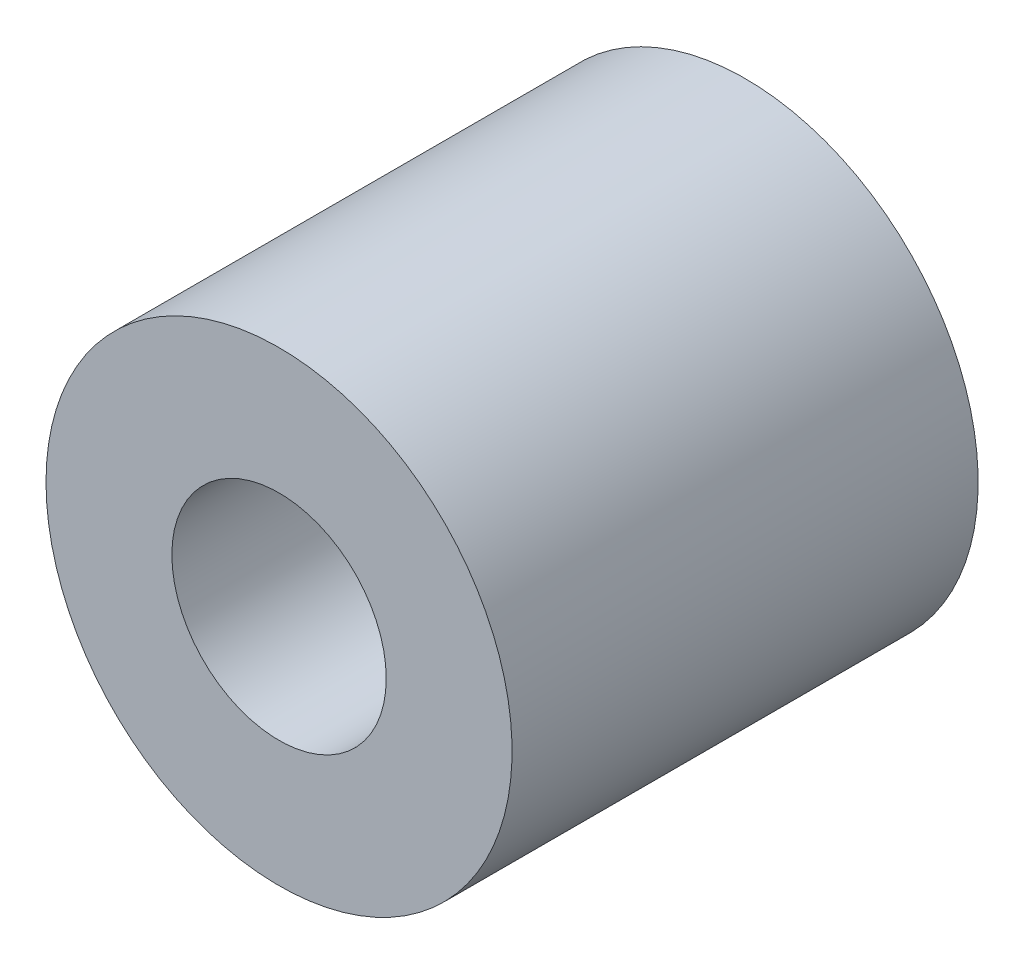
ISO-10303-21;
HEADER;
FILE_DESCRIPTION(('STEP AP214'),'2;1');
FILE_NAME('part.step','',(''),(''),'','','');
FILE_SCHEMA(('AUTOMOTIVE_DESIGN { 1 0 10303 214 1 1 1 1 }'));
ENDSEC;
DATA;
#1=APPLICATION_CONTEXT('core data for automotive mechanical design processes');
#2=APPLICATION_PROTOCOL_DEFINITION('international standard','automotive_design',2000,#1);
#3=PRODUCT_CONTEXT('',#1,'mechanical');
#4=PRODUCT('Part','Part','',(#3));
#5=PRODUCT_RELATED_PRODUCT_CATEGORY('part','',(#4));
#6=PRODUCT_DEFINITION_FORMATION('','',#4);
#7=PRODUCT_DEFINITION_CONTEXT('part definition',#1,'design');
#8=PRODUCT_DEFINITION('design','',#6,#7);
#9=PRODUCT_DEFINITION_SHAPE('','',#8);
#10=(LENGTH_UNIT() NAMED_UNIT(*) SI_UNIT(.MILLI.,.METRE.));
#11=(NAMED_UNIT(*) PLANE_ANGLE_UNIT() SI_UNIT($,.RADIAN.));
#12=(NAMED_UNIT(*) SI_UNIT($,.STERADIAN.) SOLID_ANGLE_UNIT());
#13=UNCERTAINTY_MEASURE_WITH_UNIT(LENGTH_MEASURE(1.E-05),#10,'distance_accuracy_value','');
#14=(GEOMETRIC_REPRESENTATION_CONTEXT(3) GLOBAL_UNCERTAINTY_ASSIGNED_CONTEXT((#13)) GLOBAL_UNIT_ASSIGNED_CONTEXT((#10,
#11,#12)) REPRESENTATION_CONTEXT('',''));
#15=CARTESIAN_POINT('',(0.,0.,0.));
#16=DIRECTION('',(0.,0.,1.));
#17=DIRECTION('',(1.,0.,0.));
#18=AXIS2_PLACEMENT_3D('',#15,#16,#17);
#19=CARTESIAN_POINT('',(0.,0.,3.17499999999993));
#20=DIRECTION('',(0.,0.,0.999999999999983));
#21=DIRECTION('',(1.00000000000002,0.,0.));
#22=AXIS2_PLACEMENT_3D('',#19,#20,#21);
#23=PLANE('',#22);
#24=CARTESIAN_POINT('',(0.,0.,3.17499999999993));
#25=DIRECTION('',(0.,0.,0.999999999999983));
#26=DIRECTION('',(1.00000000000002,0.,0.));
#27=AXIS2_PLACEMENT_3D('',#24,#25,#26);
#28=CIRCLE('',#27,3.175);
#29=CARTESIAN_POINT('',(-3.17500000000007,0.,3.17499999999993));
#30=VERTEX_POINT('',#29);
#31=EDGE_CURVE('E12',#30,#30,#28,.T.);
#32=ORIENTED_EDGE('',*,*,#31,.T.);
#33=EDGE_LOOP('',(#32));
#34=FACE_BOUND('',#33,.T.);
#35=CARTESIAN_POINT('',(0.,0.,3.17499999999993));
#36=DIRECTION('',(0.,0.,0.999999999999983));
#37=DIRECTION('',(1.00000000000002,0.,0.));
#38=AXIS2_PLACEMENT_3D('',#35,#36,#37);
#39=CIRCLE('',#38,1.4605);
#40=CARTESIAN_POINT('',(-1.46050000000003,0.,3.17499999999993));
#41=VERTEX_POINT('',#40);
#42=EDGE_CURVE('E47',#41,#41,#39,.T.);
#43=ORIENTED_EDGE('',*,*,#42,.F.);
#44=EDGE_LOOP('',(#43));
#45=FACE_BOUND('',#44,.T.);
#46=ADVANCED_FACE('F40',(#34,#45),#23,.T.);
#47=CARTESIAN_POINT('',(0.,0.,3.17499999999993));
#48=DIRECTION('',(0.,0.,-0.999999999999983));
#49=DIRECTION('',(-1.00000000000002,0.,0.));
#50=AXIS2_PLACEMENT_3D('',#47,#48,#49);
#51=CYLINDRICAL_SURFACE('',#50,3.175);
#52=CARTESIAN_POINT('',(0.,0.,-3.17499999999993));
#53=DIRECTION('',(0.,0.,0.999999999999983));
#54=DIRECTION('',(1.00000000000002,0.,0.));
#55=AXIS2_PLACEMENT_3D('',#52,#53,#54);
#56=CIRCLE('',#55,3.175);
#57=CARTESIAN_POINT('',(-3.17500000000007,0.,-3.17499999999993));
#58=VERTEX_POINT('',#57);
#59=EDGE_CURVE('E51',#58,#58,#56,.T.);
#60=CARTESIAN_POINT('',(-3.17500000000007,0.,3.17499999999993));
#61=CARTESIAN_POINT('',(-3.17500000000007,0.,3.1088541666666));
#62=CARTESIAN_POINT('',(-3.17500000000007,0.,3.04270833333326));
#63=CARTESIAN_POINT('',(-3.17500000000007,0.,2.9104166666666));
#64=CARTESIAN_POINT('',(-3.17500000000007,0.,2.84427083333327));
#65=CARTESIAN_POINT('',(-3.17500000000007,0.,2.7119791666666));
#66=CARTESIAN_POINT('',(-3.17500000000007,0.,2.64583333333327));
#67=CARTESIAN_POINT('',(-3.17500000000007,0.,2.51354166666661));
#68=CARTESIAN_POINT('',(-3.17500000000007,0.,2.44739583333328));
#69=CARTESIAN_POINT('',(-3.17500000000007,0.,2.31510416666661));
#70=CARTESIAN_POINT('',(-3.17500000000007,0.,2.24895833333328));
#71=CARTESIAN_POINT('',(-3.17500000000007,0.,2.11666666666662));
#72=CARTESIAN_POINT('',(-3.17500000000007,0.,2.05052083333329));
#73=CARTESIAN_POINT('',(-3.17500000000007,0.,1.91822916666662));
#74=CARTESIAN_POINT('',(-3.17500000000007,0.,1.85208333333329));
#75=CARTESIAN_POINT('',(-3.17500000000007,0.,1.71979166666663));
#76=CARTESIAN_POINT('',(-3.17500000000007,0.,1.6536458333333));
#77=CARTESIAN_POINT('',(-3.17500000000007,0.,1.52135416666663));
#78=CARTESIAN_POINT('',(-3.17500000000007,0.,1.4552083333333));
#79=CARTESIAN_POINT('',(-3.17500000000007,0.,1.32291666666664));
#80=CARTESIAN_POINT('',(-3.17500000000007,0.,1.2567708333333));
#81=CARTESIAN_POINT('',(-3.17500000000007,0.,1.12447916666664));
#82=CARTESIAN_POINT('',(-3.17500000000007,0.,1.05833333333331));
#83=CARTESIAN_POINT('',(-3.17500000000007,0.,0.926041666666645));
#84=CARTESIAN_POINT('',(-3.17500000000007,0.,0.859895833333313));
#85=CARTESIAN_POINT('',(-3.17500000000007,0.,0.727604166666649));
#86=CARTESIAN_POINT('',(-3.17500000000007,0.,0.661458333333318));
#87=CARTESIAN_POINT('',(-3.17500000000007,0.,0.529166666666654));
#88=CARTESIAN_POINT('',(-3.17500000000007,0.,0.463020833333322));
#89=CARTESIAN_POINT('',(-3.17500000000007,0.,0.330729166666659));
#90=CARTESIAN_POINT('',(-3.17500000000007,0.,0.264583333333327));
#91=CARTESIAN_POINT('',(-3.17500000000007,0.,0.132291666666663));
#92=CARTESIAN_POINT('',(-3.17500000000007,0.,0.0661458333333314));
#93=CARTESIAN_POINT('',(-3.17500000000007,0.,-0.0661458333333323));
#94=CARTESIAN_POINT('',(-3.17500000000007,0.,-0.132291666666664));
#95=CARTESIAN_POINT('',(-3.17500000000007,0.,-0.264583333333328));
#96=CARTESIAN_POINT('',(-3.17500000000007,0.,-0.33072916666666));
#97=CARTESIAN_POINT('',(-3.17500000000007,0.,-0.463020833333323));
#98=CARTESIAN_POINT('',(-3.17500000000007,0.,-0.529166666666655));
#99=CARTESIAN_POINT('',(-3.17500000000007,0.,-0.661458333333319));
#100=CARTESIAN_POINT('',(-3.17500000000007,0.,-0.72760416666665));
#101=CARTESIAN_POINT('',(-3.17500000000007,0.,-0.859895833333314));
#102=CARTESIAN_POINT('',(-3.17500000000007,0.,-0.926041666666646));
#103=CARTESIAN_POINT('',(-3.17500000000007,0.,-1.05833333333331));
#104=CARTESIAN_POINT('',(-3.17500000000007,0.,-1.12447916666664));
#105=CARTESIAN_POINT('',(-3.17500000000007,0.,-1.2567708333333));
#106=CARTESIAN_POINT('',(-3.17500000000007,0.,-1.32291666666664));
#107=CARTESIAN_POINT('',(-3.17500000000007,0.,-1.4552083333333));
#108=CARTESIAN_POINT('',(-3.17500000000007,0.,-1.52135416666663));
#109=CARTESIAN_POINT('',(-3.17500000000007,0.,-1.6536458333333));
#110=CARTESIAN_POINT('',(-3.17500000000007,0.,-1.71979166666663));
#111=CARTESIAN_POINT('',(-3.17500000000007,0.,-1.85208333333329));
#112=CARTESIAN_POINT('',(-3.17500000000007,0.,-1.91822916666662));
#113=CARTESIAN_POINT('',(-3.17500000000007,0.,-2.05052083333329));
#114=CARTESIAN_POINT('',(-3.17500000000007,0.,-2.11666666666662));
#115=CARTESIAN_POINT('',(-3.17500000000007,0.,-2.24895833333328));
#116=CARTESIAN_POINT('',(-3.17500000000007,0.,-2.31510416666661));
#117=CARTESIAN_POINT('',(-3.17500000000007,0.,-2.44739583333328));
#118=CARTESIAN_POINT('',(-3.17500000000007,0.,-2.51354166666661));
#119=CARTESIAN_POINT('',(-3.17500000000007,0.,-2.64583333333327));
#120=CARTESIAN_POINT('',(-3.17500000000007,0.,-2.71197916666661));
#121=CARTESIAN_POINT('',(-3.17500000000007,0.,-2.84427083333327));
#122=CARTESIAN_POINT('',(-3.17500000000007,0.,-2.9104166666666));
#123=CARTESIAN_POINT('',(-3.17500000000007,0.,-3.04270833333326));
#124=CARTESIAN_POINT('',(-3.17500000000007,0.,-3.1088541666666));
#125=CARTESIAN_POINT('',(-3.17500000000007,0.,-3.17499999999993));
#126=B_SPLINE_CURVE_WITH_KNOTS('',3,(#60,#61,#62,#63,#64,#65,#66,#67,#68,#69,#70,#71,#72,#73,
#74,#75,#76,#77,#78,#79,#80,#81,#82,#83,#84,#85,#86,#87,#88,#89,#90,#91,#92,#93,#94,#95,#96,#97,
#98,#99,#100,#101,#102,#103,#104,#105,#106,#107,#108,#109,#110,#111,#112,#113,#114,#115,#116,
#117,#118,#119,#120,#121,#122,#123,#124,#125),.UNSPECIFIED.,.F.,.F.,(4,2,2,2,2,2,2,2,2,2,2,2,2,
2,2,2,2,2,2,2,2,2,2,2,2,2,2,2,2,2,2,2,4),(0.,0.198437499999995,0.396874999999991,
0.595312499999986,0.793749999999982,0.992187499999977,1.19062499999997,1.38906249999997,
1.58749999999996,1.78593749999996,1.98437499999995,2.18281249999995,2.38124999999995,
2.57968749999994,2.77812499999994,2.97656249999993,3.17499999999993,3.37343749999992,
3.57187499999992,3.77031249999991,3.96874999999991,4.16718749999991,4.3656249999999,
4.5640624999999,4.76249999999989,4.96093749999989,5.15937499999988,5.35781249999988,
5.55624999999987,5.75468749999987,5.95312499999986,6.15156249999986,6.34999999999986),.UNSPECIFIED.);
#127=EDGE_CURVE('BSEAM42',#30,#58,#126,.T.);
#128=ORIENTED_EDGE('',*,*,#31,.F.);
#129=ORIENTED_EDGE('',*,*,#59,.T.);
#130=ORIENTED_EDGE('',*,*,#127,.T.);
#131=ORIENTED_EDGE('',*,*,#127,.F.);
#132=EDGE_LOOP('',(#128,#130,#129,#131));
#133=FACE_BOUND('',#132,.T.);
#134=ADVANCED_FACE('F42',(#133),#51,.T.);
#135=CARTESIAN_POINT('',(0.,0.,3.17499999999993));
#136=DIRECTION('',(0.,0.,-0.999999999999983));
#137=DIRECTION('',(-1.00000000000002,0.,0.));
#138=AXIS2_PLACEMENT_3D('',#135,#136,#137);
#139=CYLINDRICAL_SURFACE('',#138,1.4605);
#140=CARTESIAN_POINT('',(0.,0.,-3.17499999999993));
#141=DIRECTION('',(0.,0.,0.999999999999983));
#142=DIRECTION('',(1.00000000000002,0.,0.));
#143=AXIS2_PLACEMENT_3D('',#140,#141,#142);
#144=CIRCLE('',#143,1.4605);
#145=CARTESIAN_POINT('',(-1.46050000000003,0.,-3.17499999999993));
#146=VERTEX_POINT('',#145);
#147=EDGE_CURVE('E55',#146,#146,#144,.T.);
#148=CARTESIAN_POINT('',(-1.46050000000003,0.,3.17499999999993));
#149=CARTESIAN_POINT('',(-1.46050000000003,0.,3.1088541666666));
#150=CARTESIAN_POINT('',(-1.46050000000003,0.,3.04270833333326));
#151=CARTESIAN_POINT('',(-1.46050000000003,0.,2.9104166666666));
#152=CARTESIAN_POINT('',(-1.46050000000003,0.,2.84427083333327));
#153=CARTESIAN_POINT('',(-1.46050000000003,0.,2.7119791666666));
#154=CARTESIAN_POINT('',(-1.46050000000003,0.,2.64583333333327));
#155=CARTESIAN_POINT('',(-1.46050000000003,0.,2.51354166666661));
#156=CARTESIAN_POINT('',(-1.46050000000003,0.,2.44739583333328));
#157=CARTESIAN_POINT('',(-1.46050000000003,0.,2.31510416666661));
#158=CARTESIAN_POINT('',(-1.46050000000003,0.,2.24895833333328));
#159=CARTESIAN_POINT('',(-1.46050000000003,0.,2.11666666666662));
#160=CARTESIAN_POINT('',(-1.46050000000003,0.,2.05052083333329));
#161=CARTESIAN_POINT('',(-1.46050000000003,0.,1.91822916666662));
#162=CARTESIAN_POINT('',(-1.46050000000003,0.,1.85208333333329));
#163=CARTESIAN_POINT('',(-1.46050000000003,0.,1.71979166666663));
#164=CARTESIAN_POINT('',(-1.46050000000003,0.,1.6536458333333));
#165=CARTESIAN_POINT('',(-1.46050000000003,0.,1.52135416666663));
#166=CARTESIAN_POINT('',(-1.46050000000003,0.,1.4552083333333));
#167=CARTESIAN_POINT('',(-1.46050000000003,0.,1.32291666666664));
#168=CARTESIAN_POINT('',(-1.46050000000003,0.,1.2567708333333));
#169=CARTESIAN_POINT('',(-1.46050000000003,0.,1.12447916666664));
#170=CARTESIAN_POINT('',(-1.46050000000003,0.,1.05833333333331));
#171=CARTESIAN_POINT('',(-1.46050000000003,0.,0.926041666666645));
#172=CARTESIAN_POINT('',(-1.46050000000003,0.,0.859895833333313));
#173=CARTESIAN_POINT('',(-1.46050000000003,0.,0.727604166666649));
#174=CARTESIAN_POINT('',(-1.46050000000003,0.,0.661458333333318));
#175=CARTESIAN_POINT('',(-1.46050000000003,0.,0.529166666666654));
#176=CARTESIAN_POINT('',(-1.46050000000003,0.,0.463020833333322));
#177=CARTESIAN_POINT('',(-1.46050000000003,0.,0.330729166666659));
#178=CARTESIAN_POINT('',(-1.46050000000003,0.,0.264583333333327));
#179=CARTESIAN_POINT('',(-1.46050000000003,0.,0.132291666666663));
#180=CARTESIAN_POINT('',(-1.46050000000003,0.,0.0661458333333314));
#181=CARTESIAN_POINT('',(-1.46050000000003,0.,-0.0661458333333323));
#182=CARTESIAN_POINT('',(-1.46050000000003,0.,-0.132291666666664));
#183=CARTESIAN_POINT('',(-1.46050000000003,0.,-0.264583333333328));
#184=CARTESIAN_POINT('',(-1.46050000000003,0.,-0.33072916666666));
#185=CARTESIAN_POINT('',(-1.46050000000003,0.,-0.463020833333323));
#186=CARTESIAN_POINT('',(-1.46050000000003,0.,-0.529166666666655));
#187=CARTESIAN_POINT('',(-1.46050000000003,0.,-0.661458333333319));
#188=CARTESIAN_POINT('',(-1.46050000000003,0.,-0.72760416666665));
#189=CARTESIAN_POINT('',(-1.46050000000003,0.,-0.859895833333314));
#190=CARTESIAN_POINT('',(-1.46050000000003,0.,-0.926041666666646));
#191=CARTESIAN_POINT('',(-1.46050000000003,0.,-1.05833333333331));
#192=CARTESIAN_POINT('',(-1.46050000000003,0.,-1.12447916666664));
#193=CARTESIAN_POINT('',(-1.46050000000003,0.,-1.2567708333333));
#194=CARTESIAN_POINT('',(-1.46050000000003,0.,-1.32291666666664));
#195=CARTESIAN_POINT('',(-1.46050000000003,0.,-1.4552083333333));
#196=CARTESIAN_POINT('',(-1.46050000000003,0.,-1.52135416666663));
#197=CARTESIAN_POINT('',(-1.46050000000003,0.,-1.6536458333333));
#198=CARTESIAN_POINT('',(-1.46050000000003,0.,-1.71979166666663));
#199=CARTESIAN_POINT('',(-1.46050000000003,0.,-1.85208333333329));
#200=CARTESIAN_POINT('',(-1.46050000000003,0.,-1.91822916666662));
#201=CARTESIAN_POINT('',(-1.46050000000003,0.,-2.05052083333329));
#202=CARTESIAN_POINT('',(-1.46050000000003,0.,-2.11666666666662));
#203=CARTESIAN_POINT('',(-1.46050000000003,0.,-2.24895833333328));
#204=CARTESIAN_POINT('',(-1.46050000000003,0.,-2.31510416666661));
#205=CARTESIAN_POINT('',(-1.46050000000003,0.,-2.44739583333328));
#206=CARTESIAN_POINT('',(-1.46050000000003,0.,-2.51354166666661));
#207=CARTESIAN_POINT('',(-1.46050000000003,0.,-2.64583333333327));
#208=CARTESIAN_POINT('',(-1.46050000000003,0.,-2.71197916666661));
#209=CARTESIAN_POINT('',(-1.46050000000003,0.,-2.84427083333327));
#210=CARTESIAN_POINT('',(-1.46050000000003,0.,-2.9104166666666));
#211=CARTESIAN_POINT('',(-1.46050000000003,0.,-3.04270833333326));
#212=CARTESIAN_POINT('',(-1.46050000000003,0.,-3.1088541666666));
#213=CARTESIAN_POINT('',(-1.46050000000003,0.,-3.17499999999993));
#214=B_SPLINE_CURVE_WITH_KNOTS('',3,(#148,#149,#150,#151,#152,#153,#154,#155,#156,#157,#158,
#159,#160,#161,#162,#163,#164,#165,#166,#167,#168,#169,#170,#171,#172,#173,#174,#175,#176,#177,
#178,#179,#180,#181,#182,#183,#184,#185,#186,#187,#188,#189,#190,#191,#192,#193,#194,#195,#196,
#197,#198,#199,#200,#201,#202,#203,#204,#205,#206,#207,#208,#209,#210,#211,#212,#213),
.UNSPECIFIED.,.F.,.F.,(4,2,2,2,2,2,2,2,2,2,2,2,2,2,2,2,2,2,2,2,2,2,2,2,2,2,2,2,2,2,2,2,4),(0.,
0.198437499999995,0.396874999999991,0.595312499999986,0.793749999999982,0.992187499999977,
1.19062499999997,1.38906249999997,1.58749999999996,1.78593749999996,1.98437499999995,
2.18281249999995,2.38124999999995,2.57968749999994,2.77812499999994,2.97656249999993,
3.17499999999993,3.37343749999992,3.57187499999992,3.77031249999991,3.96874999999991,
4.16718749999991,4.3656249999999,4.5640624999999,4.76249999999989,4.96093749999989,
5.15937499999988,5.35781249999988,5.55624999999987,5.75468749999987,5.95312499999986,
6.15156249999986,6.34999999999986),.UNSPECIFIED.);
#215=EDGE_CURVE('BSEAM64',#41,#146,#214,.T.);
#216=ORIENTED_EDGE('',*,*,#42,.T.);
#217=ORIENTED_EDGE('',*,*,#147,.F.);
#218=ORIENTED_EDGE('',*,*,#215,.T.);
#219=ORIENTED_EDGE('',*,*,#215,.F.);
#220=EDGE_LOOP('',(#216,#218,#217,#219));
#221=FACE_BOUND('',#220,.T.);
#222=ADVANCED_FACE('F64',(#221),#139,.F.);
#223=CARTESIAN_POINT('',(0.,0.,-3.17499999999993));
#224=DIRECTION('',(0.,0.,0.999999999999983));
#225=DIRECTION('',(1.00000000000002,0.,0.));
#226=AXIS2_PLACEMENT_3D('',#223,#224,#225);
#227=PLANE('',#226);
#228=ORIENTED_EDGE('',*,*,#147,.T.);
#229=EDGE_LOOP('',(#228));
#230=FACE_BOUND('',#229,.T.);
#231=ORIENTED_EDGE('',*,*,#59,.F.);
#232=EDGE_LOOP('',(#231));
#233=FACE_BOUND('',#232,.T.);
#234=ADVANCED_FACE('F61',(#230,#233),#227,.F.);
#235=CLOSED_SHELL('',(#46,#134,#222,#234));
#236=MANIFOLD_SOLID_BREP('B2',#235);
#237=ADVANCED_BREP_SHAPE_REPRESENTATION('',(#18,#236),#14);
#238=SHAPE_DEFINITION_REPRESENTATION(#9,#237);
ENDSEC;
END-ISO-10303-21;
